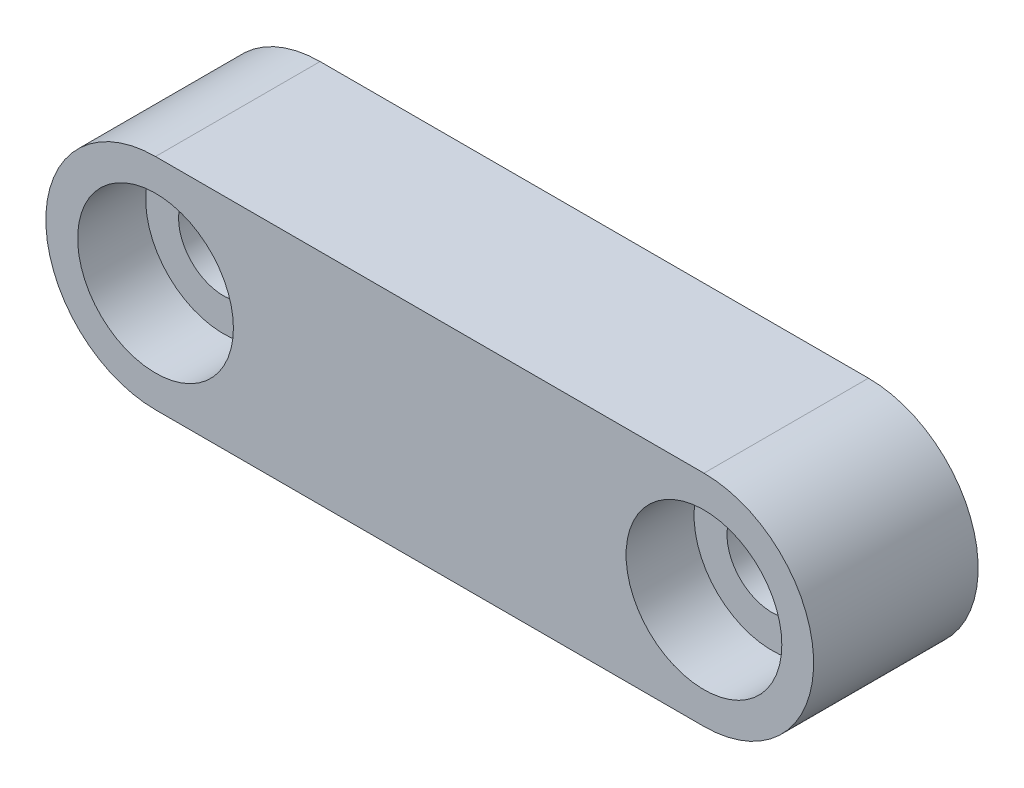
ISO-10303-21;
HEADER;
FILE_DESCRIPTION(('STEP AP214'),'2;1');
FILE_NAME('part.step','',(''),(''),'','','');
FILE_SCHEMA(('AUTOMOTIVE_DESIGN { 1 0 10303 214 1 1 1 1 }'));
ENDSEC;
DATA;
#1=APPLICATION_CONTEXT('core data for automotive mechanical design processes');
#2=APPLICATION_PROTOCOL_DEFINITION('international standard','automotive_design',2000,#1);
#3=PRODUCT_CONTEXT('',#1,'mechanical');
#4=PRODUCT('Part','Part','',(#3));
#5=PRODUCT_RELATED_PRODUCT_CATEGORY('part','',(#4));
#6=PRODUCT_DEFINITION_FORMATION('','',#4);
#7=PRODUCT_DEFINITION_CONTEXT('part definition',#1,'design');
#8=PRODUCT_DEFINITION('design','',#6,#7);
#9=PRODUCT_DEFINITION_SHAPE('','',#8);
#10=(LENGTH_UNIT() NAMED_UNIT(*) SI_UNIT(.MILLI.,.METRE.));
#11=(NAMED_UNIT(*) PLANE_ANGLE_UNIT() SI_UNIT($,.RADIAN.));
#12=(NAMED_UNIT(*) SI_UNIT($,.STERADIAN.) SOLID_ANGLE_UNIT());
#13=UNCERTAINTY_MEASURE_WITH_UNIT(LENGTH_MEASURE(1.E-05),#10,'distance_accuracy_value','');
#14=(GEOMETRIC_REPRESENTATION_CONTEXT(3) GLOBAL_UNCERTAINTY_ASSIGNED_CONTEXT((#13)) GLOBAL_UNIT_ASSIGNED_CONTEXT((#10,
#11,#12)) REPRESENTATION_CONTEXT('',''));
#15=CARTESIAN_POINT('',(0.,0.,0.));
#16=DIRECTION('',(0.,0.,1.));
#17=DIRECTION('',(1.,0.,0.));
#18=AXIS2_PLACEMENT_3D('',#15,#16,#17);
#19=CARTESIAN_POINT('',(12.5,0.,7.5));
#20=DIRECTION('',(0.,0.,-1.));
#21=DIRECTION('',(-1.,0.,0.));
#22=AXIS2_PLACEMENT_3D('',#19,#20,#21);
#23=CYLINDRICAL_SURFACE('',#22,2.05);
#24=CARTESIAN_POINT('',(12.5,0.,0.));
#25=DIRECTION('',(0.,0.,1.));
#26=DIRECTION('',(1.,0.,0.));
#27=AXIS2_PLACEMENT_3D('',#24,#25,#26);
#28=CIRCLE('',#27,2.05);
#29=CARTESIAN_POINT('',(14.55,0.,0.));
#30=VERTEX_POINT('',#29);
#31=EDGE_CURVE('E118',#30,#30,#28,.T.);
#32=ORIENTED_EDGE('',*,*,#31,.F.);
#33=EDGE_LOOP('',(#32));
#34=FACE_BOUND('',#33,.T.);
#35=CARTESIAN_POINT('',(12.5,0.,4.4));
#36=DIRECTION('',(0.,0.,1.));
#37=DIRECTION('',(1.,0.,0.));
#38=AXIS2_PLACEMENT_3D('',#35,#36,#37);
#39=CIRCLE('',#38,2.05);
#40=CARTESIAN_POINT('',(14.55,0.,4.4));
#41=VERTEX_POINT('',#40);
#42=EDGE_CURVE('E112',#41,#41,#39,.T.);
#43=ORIENTED_EDGE('',*,*,#42,.T.);
#44=EDGE_LOOP('',(#43));
#45=FACE_BOUND('',#44,.T.);
#46=ADVANCED_FACE('F37',(#34,#45),#23,.F.);
#47=CARTESIAN_POINT('',(-12.5,0.,7.5));
#48=DIRECTION('',(0.,0.,1.));
#49=DIRECTION('',(1.,0.,0.));
#50=AXIS2_PLACEMENT_3D('',#47,#48,#49);
#51=PLANE('',#50);
#52=CARTESIAN_POINT('',(12.5,0.,7.5));
#53=DIRECTION('',(0.,0.,1.));
#54=DIRECTION('',(1.,0.,0.));
#55=AXIS2_PLACEMENT_3D('',#52,#53,#54);
#56=CIRCLE('',#55,3.55);
#57=CARTESIAN_POINT('',(16.05,0.,7.5));
#58=VERTEX_POINT('',#57);
#59=EDGE_CURVE('E120',#58,#58,#56,.T.);
#60=ORIENTED_EDGE('',*,*,#59,.F.);
#61=EDGE_LOOP('',(#60));
#62=FACE_BOUND('',#61,.T.);
#63=CARTESIAN_POINT('',(-12.5,0.,7.5));
#64=DIRECTION('',(0.,0.,1.));
#65=DIRECTION('',(-1.,0.,0.));
#66=AXIS2_PLACEMENT_3D('',#63,#64,#65);
#67=CIRCLE('',#66,3.55);
#68=CARTESIAN_POINT('',(-8.95,0.,7.5));
#69=VERTEX_POINT('',#68);
#70=EDGE_CURVE('E125',#69,#69,#67,.T.);
#71=ORIENTED_EDGE('',*,*,#70,.F.);
#72=EDGE_LOOP('',(#71));
#73=FACE_BOUND('',#72,.T.);
#74=CARTESIAN_POINT('',(-12.5,0.,7.5));
#75=DIRECTION('',(0.,0.,1.));
#76=DIRECTION('',(1.,0.,0.));
#77=AXIS2_PLACEMENT_3D('',#74,#75,#76);
#78=CIRCLE('',#77,5.);
#79=CARTESIAN_POINT('',(-12.5,5.,7.5));
#80=VERTEX_POINT('',#79);
#81=CARTESIAN_POINT('',(-12.5,-5.,7.5));
#82=VERTEX_POINT('',#81);
#83=EDGE_CURVE('E91',#80,#82,#78,.T.);
#84=ORIENTED_EDGE('',*,*,#83,.T.);
#85=DIRECTION('',(1.,0.,0.));
#86=VECTOR('',#85,1.);
#87=CARTESIAN_POINT('',(-12.5,-5.,7.5));
#88=LINE('',#87,#86);
#89=CARTESIAN_POINT('',(12.5,-5.,7.5));
#90=VERTEX_POINT('',#89);
#91=EDGE_CURVE('E86',#82,#90,#88,.T.);
#92=ORIENTED_EDGE('',*,*,#91,.T.);
#93=CARTESIAN_POINT('',(12.5,0.,7.5));
#94=DIRECTION('',(0.,0.,1.));
#95=DIRECTION('',(1.,0.,0.));
#96=AXIS2_PLACEMENT_3D('',#93,#94,#95);
#97=CIRCLE('',#96,5.);
#98=CARTESIAN_POINT('',(12.5,5.,7.5));
#99=VERTEX_POINT('',#98);
#100=EDGE_CURVE('E89',#90,#99,#97,.T.);
#101=ORIENTED_EDGE('',*,*,#100,.T.);
#102=DIRECTION('',(-1.,0.,0.));
#103=VECTOR('',#102,1.);
#104=CARTESIAN_POINT('',(-12.5,5.,7.5));
#105=LINE('',#104,#103);
#106=EDGE_CURVE('E56',#99,#80,#105,.T.);
#107=ORIENTED_EDGE('',*,*,#106,.T.);
#108=EDGE_LOOP('',(#84,#92,#101,#107));
#109=FACE_BOUND('',#108,.T.);
#110=ADVANCED_FACE('F87',(#62,#73,#109),#51,.T.);
#111=CARTESIAN_POINT('',(-12.5,0.,0.));
#112=DIRECTION('',(0.,0.,1.));
#113=DIRECTION('',(1.,0.,0.));
#114=AXIS2_PLACEMENT_3D('',#111,#112,#113);
#115=PLANE('',#114);
#116=CARTESIAN_POINT('',(-12.5,0.,0.));
#117=DIRECTION('',(0.,0.,1.));
#118=DIRECTION('',(1.,0.,0.));
#119=AXIS2_PLACEMENT_3D('',#116,#117,#118);
#120=CIRCLE('',#119,5.);
#121=CARTESIAN_POINT('',(-12.5,5.,0.));
#122=VERTEX_POINT('',#121);
#123=CARTESIAN_POINT('',(-12.5,-5.,0.));
#124=VERTEX_POINT('',#123);
#125=EDGE_CURVE('E104',#122,#124,#120,.T.);
#126=ORIENTED_EDGE('',*,*,#125,.F.);
#127=DIRECTION('',(-1.,0.,0.));
#128=VECTOR('',#127,1.);
#129=CARTESIAN_POINT('',(-12.5,5.,0.));
#130=LINE('',#129,#128);
#131=CARTESIAN_POINT('',(12.5,5.,0.));
#132=VERTEX_POINT('',#131);
#133=EDGE_CURVE('E79',#132,#122,#130,.T.);
#134=ORIENTED_EDGE('',*,*,#133,.F.);
#135=CARTESIAN_POINT('',(12.5,0.,0.));
#136=DIRECTION('',(0.,0.,1.));
#137=DIRECTION('',(1.,0.,0.));
#138=AXIS2_PLACEMENT_3D('',#135,#136,#137);
#139=CIRCLE('',#138,5.);
#140=CARTESIAN_POINT('',(12.5,-5.,0.));
#141=VERTEX_POINT('',#140);
#142=EDGE_CURVE('E73',#141,#132,#139,.T.);
#143=ORIENTED_EDGE('',*,*,#142,.F.);
#144=DIRECTION('',(1.,0.,0.));
#145=VECTOR('',#144,1.);
#146=CARTESIAN_POINT('',(-12.5,-5.,0.));
#147=LINE('',#146,#145);
#148=EDGE_CURVE('E95',#124,#141,#147,.T.);
#149=ORIENTED_EDGE('',*,*,#148,.F.);
#150=EDGE_LOOP('',(#126,#134,#143,#149));
#151=FACE_BOUND('',#150,.T.);
#152=CARTESIAN_POINT('',(-12.5,0.,0.));
#153=DIRECTION('',(0.,0.,1.));
#154=DIRECTION('',(1.,0.,0.));
#155=AXIS2_PLACEMENT_3D('',#152,#153,#154);
#156=CIRCLE('',#155,2.05);
#157=CARTESIAN_POINT('',(-10.45,0.,0.));
#158=VERTEX_POINT('',#157);
#159=EDGE_CURVE('E107',#158,#158,#156,.T.);
#160=ORIENTED_EDGE('',*,*,#159,.T.);
#161=EDGE_LOOP('',(#160));
#162=FACE_BOUND('',#161,.T.);
#163=ORIENTED_EDGE('',*,*,#31,.T.);
#164=EDGE_LOOP('',(#163));
#165=FACE_BOUND('',#164,.T.);
#166=ADVANCED_FACE('F138',(#151,#162,#165),#115,.F.);
#167=CARTESIAN_POINT('',(-12.5,0.,7.5));
#168=DIRECTION('',(0.,0.,-1.));
#169=DIRECTION('',(-1.,0.,0.));
#170=AXIS2_PLACEMENT_3D('',#167,#168,#169);
#171=CYLINDRICAL_SURFACE('',#170,5.);
#172=ORIENTED_EDGE('',*,*,#125,.T.);
#173=DIRECTION('',(0.,0.,-1.));
#174=VECTOR('',#173,1.);
#175=CARTESIAN_POINT('',(-12.5,-5.,7.5));
#176=LINE('',#175,#174);
#177=EDGE_CURVE('E11',#82,#124,#176,.T.);
#178=ORIENTED_EDGE('',*,*,#177,.F.);
#179=ORIENTED_EDGE('',*,*,#83,.F.);
#180=DIRECTION('',(0.,0.,-1.));
#181=VECTOR('',#180,1.);
#182=CARTESIAN_POINT('',(-12.5,5.,7.5));
#183=LINE('',#182,#181);
#184=EDGE_CURVE('E100',#80,#122,#183,.T.);
#185=ORIENTED_EDGE('',*,*,#184,.T.);
#186=EDGE_LOOP('',(#172,#178,#179,#185));
#187=FACE_BOUND('',#186,.T.);
#188=ADVANCED_FACE('F39',(#187),#171,.T.);
#189=CARTESIAN_POINT('',(-12.5,-5.,7.5));
#190=DIRECTION('',(0.,1.,0.));
#191=DIRECTION('',(0.,0.,1.));
#192=AXIS2_PLACEMENT_3D('',#189,#190,#191);
#193=PLANE('',#192);
#194=ORIENTED_EDGE('',*,*,#148,.T.);
#195=DIRECTION('',(0.,0.,-1.));
#196=VECTOR('',#195,1.);
#197=CARTESIAN_POINT('',(12.5,-5.,7.5));
#198=LINE('',#197,#196);
#199=EDGE_CURVE('E47',#90,#141,#198,.T.);
#200=ORIENTED_EDGE('',*,*,#199,.F.);
#201=ORIENTED_EDGE('',*,*,#91,.F.);
#202=ORIENTED_EDGE('',*,*,#177,.T.);
#203=EDGE_LOOP('',(#194,#200,#201,#202));
#204=FACE_BOUND('',#203,.T.);
#205=ADVANCED_FACE('F94',(#204),#193,.F.);
#206=CARTESIAN_POINT('',(12.5,0.,7.5));
#207=DIRECTION('',(0.,0.,-1.));
#208=DIRECTION('',(-1.,0.,0.));
#209=AXIS2_PLACEMENT_3D('',#206,#207,#208);
#210=CYLINDRICAL_SURFACE('',#209,5.);
#211=ORIENTED_EDGE('',*,*,#142,.T.);
#212=DIRECTION('',(0.,0.,-1.));
#213=VECTOR('',#212,1.);
#214=CARTESIAN_POINT('',(12.5,5.,7.5));
#215=LINE('',#214,#213);
#216=EDGE_CURVE('E96',#99,#132,#215,.T.);
#217=ORIENTED_EDGE('',*,*,#216,.F.);
#218=ORIENTED_EDGE('',*,*,#100,.F.);
#219=ORIENTED_EDGE('',*,*,#199,.T.);
#220=EDGE_LOOP('',(#211,#217,#218,#219));
#221=FACE_BOUND('',#220,.T.);
#222=ADVANCED_FACE('F98',(#221),#210,.T.);
#223=CARTESIAN_POINT('',(-12.5,5.,7.5));
#224=DIRECTION('',(0.,-1.,0.));
#225=DIRECTION('',(0.,0.,-1.));
#226=AXIS2_PLACEMENT_3D('',#223,#224,#225);
#227=PLANE('',#226);
#228=ORIENTED_EDGE('',*,*,#133,.T.);
#229=ORIENTED_EDGE('',*,*,#184,.F.);
#230=ORIENTED_EDGE('',*,*,#106,.F.);
#231=ORIENTED_EDGE('',*,*,#216,.T.);
#232=EDGE_LOOP('',(#228,#229,#230,#231));
#233=FACE_BOUND('',#232,.T.);
#234=ADVANCED_FACE('F144',(#233),#227,.F.);
#235=CARTESIAN_POINT('',(-12.5,0.,7.5));
#236=DIRECTION('',(0.,0.,-1.));
#237=DIRECTION('',(-1.,0.,0.));
#238=AXIS2_PLACEMENT_3D('',#235,#236,#237);
#239=CYLINDRICAL_SURFACE('',#238,2.05);
#240=CARTESIAN_POINT('',(-12.5,0.,4.4));
#241=DIRECTION('',(0.,0.,-1.));
#242=DIRECTION('',(-1.,0.,0.));
#243=AXIS2_PLACEMENT_3D('',#240,#241,#242);
#244=CIRCLE('',#243,2.05);
#245=CARTESIAN_POINT('',(-14.55,0.,4.4));
#246=VERTEX_POINT('',#245);
#247=EDGE_CURVE('E41',#246,#246,#244,.T.);
#248=ORIENTED_EDGE('',*,*,#247,.F.);
#249=EDGE_LOOP('',(#248));
#250=FACE_BOUND('',#249,.T.);
#251=ORIENTED_EDGE('',*,*,#159,.F.);
#252=EDGE_LOOP('',(#251));
#253=FACE_BOUND('',#252,.T.);
#254=ADVANCED_FACE('F141',(#250,#253),#239,.F.);
#255=CARTESIAN_POINT('',(12.5,0.,4.4));
#256=DIRECTION('',(0.,0.,1.));
#257=DIRECTION('',(1.,0.,0.));
#258=AXIS2_PLACEMENT_3D('',#255,#256,#257);
#259=CYLINDRICAL_SURFACE('',#258,3.55);
#260=CARTESIAN_POINT('',(12.5,0.,4.4));
#261=DIRECTION('',(0.,0.,1.));
#262=DIRECTION('',(1.,0.,0.));
#263=AXIS2_PLACEMENT_3D('',#260,#261,#262);
#264=CIRCLE('',#263,3.55);
#265=CARTESIAN_POINT('',(16.05,0.,4.4));
#266=VERTEX_POINT('',#265);
#267=EDGE_CURVE('E114',#266,#266,#264,.T.);
#268=CARTESIAN_POINT('',(16.05,0.,4.4));
#269=CARTESIAN_POINT('',(16.05,0.,4.43229166666667));
#270=CARTESIAN_POINT('',(16.05,0.,4.46458333333333));
#271=CARTESIAN_POINT('',(16.05,0.,4.52916666666667));
#272=CARTESIAN_POINT('',(16.05,0.,4.56145833333333));
#273=CARTESIAN_POINT('',(16.05,0.,4.62604166666667));
#274=CARTESIAN_POINT('',(16.05,0.,4.65833333333333));
#275=CARTESIAN_POINT('',(16.05,0.,4.72291666666667));
#276=CARTESIAN_POINT('',(16.05,0.,4.75520833333333));
#277=CARTESIAN_POINT('',(16.05,0.,4.81979166666667));
#278=CARTESIAN_POINT('',(16.05,0.,4.85208333333333));
#279=CARTESIAN_POINT('',(16.05,0.,4.91666666666667));
#280=CARTESIAN_POINT('',(16.05,0.,4.94895833333333));
#281=CARTESIAN_POINT('',(16.05,0.,5.01354166666667));
#282=CARTESIAN_POINT('',(16.05,0.,5.04583333333333));
#283=CARTESIAN_POINT('',(16.05,0.,5.11041666666667));
#284=CARTESIAN_POINT('',(16.05,0.,5.14270833333333));
#285=CARTESIAN_POINT('',(16.05,0.,5.20729166666667));
#286=CARTESIAN_POINT('',(16.05,0.,5.23958333333333));
#287=CARTESIAN_POINT('',(16.05,0.,5.30416666666667));
#288=CARTESIAN_POINT('',(16.05,0.,5.33645833333333));
#289=CARTESIAN_POINT('',(16.05,0.,5.40104166666667));
#290=CARTESIAN_POINT('',(16.05,0.,5.43333333333333));
#291=CARTESIAN_POINT('',(16.05,0.,5.49791666666667));
#292=CARTESIAN_POINT('',(16.05,0.,5.53020833333333));
#293=CARTESIAN_POINT('',(16.05,0.,5.59479166666667));
#294=CARTESIAN_POINT('',(16.05,0.,5.62708333333333));
#295=CARTESIAN_POINT('',(16.05,0.,5.69166666666667));
#296=CARTESIAN_POINT('',(16.05,0.,5.72395833333333));
#297=CARTESIAN_POINT('',(16.05,0.,5.78854166666667));
#298=CARTESIAN_POINT('',(16.05,0.,5.82083333333333));
#299=CARTESIAN_POINT('',(16.05,0.,5.88541666666667));
#300=CARTESIAN_POINT('',(16.05,0.,5.91770833333333));
#301=CARTESIAN_POINT('',(16.05,0.,5.98229166666667));
#302=CARTESIAN_POINT('',(16.05,0.,6.01458333333333));
#303=CARTESIAN_POINT('',(16.05,0.,6.07916666666667));
#304=CARTESIAN_POINT('',(16.05,0.,6.11145833333333));
#305=CARTESIAN_POINT('',(16.05,0.,6.17604166666667));
#306=CARTESIAN_POINT('',(16.05,0.,6.20833333333333));
#307=CARTESIAN_POINT('',(16.05,0.,6.27291666666667));
#308=CARTESIAN_POINT('',(16.05,0.,6.30520833333333));
#309=CARTESIAN_POINT('',(16.05,0.,6.36979166666667));
#310=CARTESIAN_POINT('',(16.05,0.,6.40208333333333));
#311=CARTESIAN_POINT('',(16.05,0.,6.46666666666667));
#312=CARTESIAN_POINT('',(16.05,0.,6.49895833333333));
#313=CARTESIAN_POINT('',(16.05,0.,6.56354166666667));
#314=CARTESIAN_POINT('',(16.05,0.,6.59583333333333));
#315=CARTESIAN_POINT('',(16.05,0.,6.66041666666667));
#316=CARTESIAN_POINT('',(16.05,0.,6.69270833333333));
#317=CARTESIAN_POINT('',(16.05,0.,6.75729166666667));
#318=CARTESIAN_POINT('',(16.05,0.,6.78958333333333));
#319=CARTESIAN_POINT('',(16.05,0.,6.85416666666667));
#320=CARTESIAN_POINT('',(16.05,0.,6.88645833333333));
#321=CARTESIAN_POINT('',(16.05,0.,6.95104166666667));
#322=CARTESIAN_POINT('',(16.05,0.,6.98333333333333));
#323=CARTESIAN_POINT('',(16.05,0.,7.04791666666667));
#324=CARTESIAN_POINT('',(16.05,0.,7.08020833333333));
#325=CARTESIAN_POINT('',(16.05,0.,7.14479166666667));
#326=CARTESIAN_POINT('',(16.05,0.,7.17708333333333));
#327=CARTESIAN_POINT('',(16.05,0.,7.24166666666667));
#328=CARTESIAN_POINT('',(16.05,0.,7.27395833333333));
#329=CARTESIAN_POINT('',(16.05,0.,7.33854166666667));
#330=CARTESIAN_POINT('',(16.05,0.,7.37083333333333));
#331=CARTESIAN_POINT('',(16.05,0.,7.43541666666667));
#332=CARTESIAN_POINT('',(16.05,0.,7.46770833333333));
#333=CARTESIAN_POINT('',(16.05,0.,7.5));
#334=B_SPLINE_CURVE_WITH_KNOTS('',3,(#268,#269,#270,#271,#272,#273,#274,#275,#276,#277,#278,
#279,#280,#281,#282,#283,#284,#285,#286,#287,#288,#289,#290,#291,#292,#293,#294,#295,#296,#297,
#298,#299,#300,#301,#302,#303,#304,#305,#306,#307,#308,#309,#310,#311,#312,#313,#314,#315,#316,
#317,#318,#319,#320,#321,#322,#323,#324,#325,#326,#327,#328,#329,#330,#331,#332,#333),
.UNSPECIFIED.,.F.,.F.,(4,2,2,2,2,2,2,2,2,2,2,2,2,2,2,2,2,2,2,2,2,2,2,2,2,2,2,2,2,2,2,2,4),(0.,
0.0968750000000006,0.19375,0.290625,0.387500000000001,0.484375,0.58125,0.678125000000001,0.775,
0.871875,0.968750000000001,1.065625,1.1625,1.259375,1.35625,1.453125,1.55,1.646875,1.74375,
1.840625,1.9375,2.034375,2.13125,2.228125,2.325,2.421875,2.51875,2.615625,2.7125,2.809375,
2.90625,3.003125,3.1),.UNSPECIFIED.);
#335=EDGE_CURVE('BSEAM143',#266,#58,#334,.T.);
#336=ORIENTED_EDGE('',*,*,#267,.F.);
#337=ORIENTED_EDGE('',*,*,#59,.T.);
#338=ORIENTED_EDGE('',*,*,#335,.T.);
#339=ORIENTED_EDGE('',*,*,#335,.F.);
#340=EDGE_LOOP('',(#336,#338,#337,#339));
#341=FACE_BOUND('',#340,.T.);
#342=ADVANCED_FACE('F143',(#341),#259,.F.);
#343=CARTESIAN_POINT('',(12.5,0.,4.4));
#344=DIRECTION('',(0.,0.,1.));
#345=DIRECTION('',(1.,0.,0.));
#346=AXIS2_PLACEMENT_3D('',#343,#344,#345);
#347=PLANE('',#346);
#348=ORIENTED_EDGE('',*,*,#42,.F.);
#349=EDGE_LOOP('',(#348));
#350=FACE_BOUND('',#349,.T.);
#351=ORIENTED_EDGE('',*,*,#267,.T.);
#352=EDGE_LOOP('',(#351));
#353=FACE_BOUND('',#352,.T.);
#354=ADVANCED_FACE('F151',(#350,#353),#347,.T.);
#355=CARTESIAN_POINT('',(-12.5,0.,4.4));
#356=DIRECTION('',(0.,0.,1.));
#357=DIRECTION('',(1.,0.,0.));
#358=AXIS2_PLACEMENT_3D('',#355,#356,#357);
#359=CYLINDRICAL_SURFACE('',#358,3.55);
#360=CARTESIAN_POINT('',(-12.5,0.,4.4));
#361=DIRECTION('',(0.,0.,1.));
#362=DIRECTION('',(-1.,0.,0.));
#363=AXIS2_PLACEMENT_3D('',#360,#361,#362);
#364=CIRCLE('',#363,3.55);
#365=CARTESIAN_POINT('',(-8.95,0.,4.4));
#366=VERTEX_POINT('',#365);
#367=EDGE_CURVE('E130',#366,#366,#364,.T.);
#368=CARTESIAN_POINT('',(-8.95,0.,4.4));
#369=CARTESIAN_POINT('',(-8.95,0.,4.43229166666667));
#370=CARTESIAN_POINT('',(-8.95,0.,4.46458333333333));
#371=CARTESIAN_POINT('',(-8.95,0.,4.52916666666667));
#372=CARTESIAN_POINT('',(-8.95,0.,4.56145833333333));
#373=CARTESIAN_POINT('',(-8.95,0.,4.62604166666667));
#374=CARTESIAN_POINT('',(-8.95,0.,4.65833333333333));
#375=CARTESIAN_POINT('',(-8.95,0.,4.72291666666667));
#376=CARTESIAN_POINT('',(-8.95,0.,4.75520833333333));
#377=CARTESIAN_POINT('',(-8.95,0.,4.81979166666667));
#378=CARTESIAN_POINT('',(-8.95,0.,4.85208333333333));
#379=CARTESIAN_POINT('',(-8.95,0.,4.91666666666667));
#380=CARTESIAN_POINT('',(-8.95,0.,4.94895833333333));
#381=CARTESIAN_POINT('',(-8.95,0.,5.01354166666667));
#382=CARTESIAN_POINT('',(-8.95,0.,5.04583333333333));
#383=CARTESIAN_POINT('',(-8.95,0.,5.11041666666667));
#384=CARTESIAN_POINT('',(-8.95,0.,5.14270833333333));
#385=CARTESIAN_POINT('',(-8.95,0.,5.20729166666667));
#386=CARTESIAN_POINT('',(-8.95,0.,5.23958333333333));
#387=CARTESIAN_POINT('',(-8.95,0.,5.30416666666667));
#388=CARTESIAN_POINT('',(-8.95,0.,5.33645833333333));
#389=CARTESIAN_POINT('',(-8.95,0.,5.40104166666667));
#390=CARTESIAN_POINT('',(-8.95,0.,5.43333333333333));
#391=CARTESIAN_POINT('',(-8.95,0.,5.49791666666667));
#392=CARTESIAN_POINT('',(-8.95,0.,5.53020833333333));
#393=CARTESIAN_POINT('',(-8.95,0.,5.59479166666667));
#394=CARTESIAN_POINT('',(-8.95,0.,5.62708333333333));
#395=CARTESIAN_POINT('',(-8.95,0.,5.69166666666667));
#396=CARTESIAN_POINT('',(-8.95,0.,5.72395833333333));
#397=CARTESIAN_POINT('',(-8.95,0.,5.78854166666667));
#398=CARTESIAN_POINT('',(-8.95,0.,5.82083333333333));
#399=CARTESIAN_POINT('',(-8.95,0.,5.88541666666667));
#400=CARTESIAN_POINT('',(-8.95,0.,5.91770833333333));
#401=CARTESIAN_POINT('',(-8.95,0.,5.98229166666667));
#402=CARTESIAN_POINT('',(-8.95,0.,6.01458333333333));
#403=CARTESIAN_POINT('',(-8.95,0.,6.07916666666667));
#404=CARTESIAN_POINT('',(-8.95,0.,6.11145833333333));
#405=CARTESIAN_POINT('',(-8.95,0.,6.17604166666667));
#406=CARTESIAN_POINT('',(-8.95,0.,6.20833333333333));
#407=CARTESIAN_POINT('',(-8.95,0.,6.27291666666667));
#408=CARTESIAN_POINT('',(-8.95,0.,6.30520833333333));
#409=CARTESIAN_POINT('',(-8.95,0.,6.36979166666667));
#410=CARTESIAN_POINT('',(-8.95,0.,6.40208333333333));
#411=CARTESIAN_POINT('',(-8.95,0.,6.46666666666667));
#412=CARTESIAN_POINT('',(-8.95,0.,6.49895833333333));
#413=CARTESIAN_POINT('',(-8.95,0.,6.56354166666667));
#414=CARTESIAN_POINT('',(-8.95,0.,6.59583333333333));
#415=CARTESIAN_POINT('',(-8.95,0.,6.66041666666667));
#416=CARTESIAN_POINT('',(-8.95,0.,6.69270833333333));
#417=CARTESIAN_POINT('',(-8.95,0.,6.75729166666667));
#418=CARTESIAN_POINT('',(-8.95,0.,6.78958333333333));
#419=CARTESIAN_POINT('',(-8.95,0.,6.85416666666667));
#420=CARTESIAN_POINT('',(-8.95,0.,6.88645833333333));
#421=CARTESIAN_POINT('',(-8.95,0.,6.95104166666667));
#422=CARTESIAN_POINT('',(-8.95,0.,6.98333333333333));
#423=CARTESIAN_POINT('',(-8.95,0.,7.04791666666667));
#424=CARTESIAN_POINT('',(-8.95,0.,7.08020833333333));
#425=CARTESIAN_POINT('',(-8.95,0.,7.14479166666667));
#426=CARTESIAN_POINT('',(-8.95,0.,7.17708333333333));
#427=CARTESIAN_POINT('',(-8.95,0.,7.24166666666667));
#428=CARTESIAN_POINT('',(-8.95,0.,7.27395833333333));
#429=CARTESIAN_POINT('',(-8.95,0.,7.33854166666667));
#430=CARTESIAN_POINT('',(-8.95,0.,7.37083333333333));
#431=CARTESIAN_POINT('',(-8.95,0.,7.43541666666667));
#432=CARTESIAN_POINT('',(-8.95,0.,7.46770833333333));
#433=CARTESIAN_POINT('',(-8.95,0.,7.5));
#434=B_SPLINE_CURVE_WITH_KNOTS('',3,(#368,#369,#370,#371,#372,#373,#374,#375,#376,#377,#378,
#379,#380,#381,#382,#383,#384,#385,#386,#387,#388,#389,#390,#391,#392,#393,#394,#395,#396,#397,
#398,#399,#400,#401,#402,#403,#404,#405,#406,#407,#408,#409,#410,#411,#412,#413,#414,#415,#416,
#417,#418,#419,#420,#421,#422,#423,#424,#425,#426,#427,#428,#429,#430,#431,#432,#433),
.UNSPECIFIED.,.F.,.F.,(4,2,2,2,2,2,2,2,2,2,2,2,2,2,2,2,2,2,2,2,2,2,2,2,2,2,2,2,2,2,2,2,4),(0.,
0.0968750000000006,0.19375,0.290625,0.387500000000001,0.484375,0.58125,0.678125000000001,0.775,
0.871875,0.968750000000001,1.065625,1.1625,1.259375,1.35625,1.453125,1.55,1.646875,1.74375,
1.840625,1.9375,2.034375,2.13125,2.228125,2.325,2.421875,2.51875,2.615625,2.7125,2.809375,
2.90625,3.003125,3.1),.UNSPECIFIED.);
#435=EDGE_CURVE('BSEAM169',#366,#69,#434,.T.);
#436=ORIENTED_EDGE('',*,*,#367,.F.);
#437=ORIENTED_EDGE('',*,*,#70,.T.);
#438=ORIENTED_EDGE('',*,*,#435,.T.);
#439=ORIENTED_EDGE('',*,*,#435,.F.);
#440=EDGE_LOOP('',(#436,#438,#437,#439));
#441=FACE_BOUND('',#440,.T.);
#442=ADVANCED_FACE('F169',(#441),#359,.F.);
#443=CARTESIAN_POINT('',(-12.5,0.,4.4));
#444=DIRECTION('',(0.,0.,-1.));
#445=DIRECTION('',(-1.,0.,0.));
#446=AXIS2_PLACEMENT_3D('',#443,#444,#445);
#447=PLANE('',#446);
#448=ORIENTED_EDGE('',*,*,#247,.T.);
#449=EDGE_LOOP('',(#448));
#450=FACE_BOUND('',#449,.T.);
#451=ORIENTED_EDGE('',*,*,#367,.T.);
#452=EDGE_LOOP('',(#451));
#453=FACE_BOUND('',#452,.T.);
#454=ADVANCED_FACE('F166',(#450,#453),#447,.F.);
#455=CLOSED_SHELL('',(#46,#110,#166,#188,#205,#222,#234,#254,#342,#354,#442,#454));
#456=MANIFOLD_SOLID_BREP('B2',#455);
#457=ADVANCED_BREP_SHAPE_REPRESENTATION('',(#18,#456),#14);
#458=SHAPE_DEFINITION_REPRESENTATION(#9,#457);
ENDSEC;
END-ISO-10303-21;
